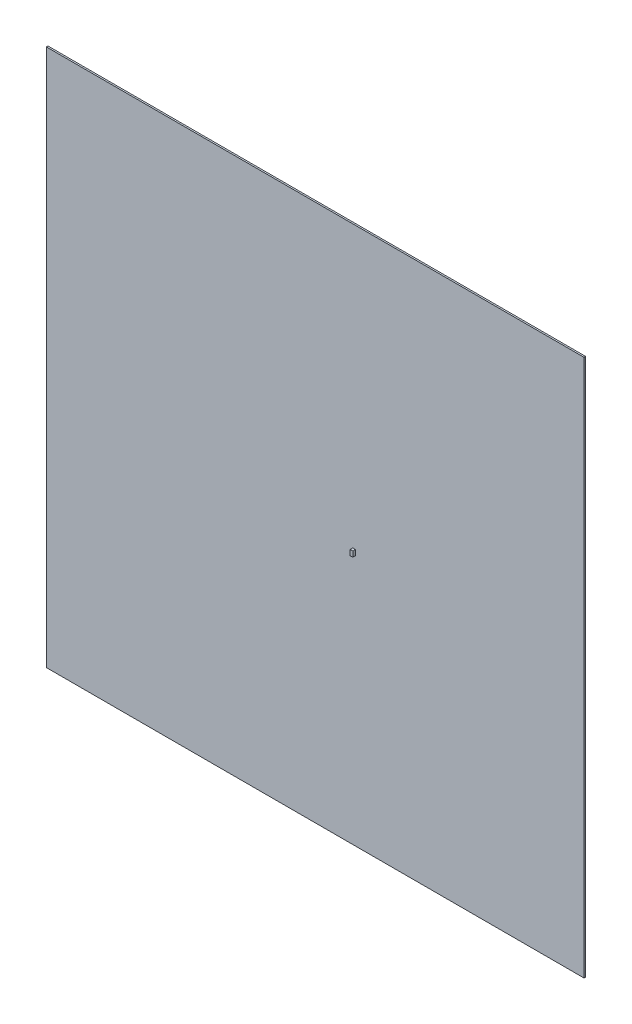
ISO-10303-21;
HEADER;
FILE_DESCRIPTION(('STEP AP214'),'2;1');
FILE_NAME('part.step','',(''),(''),'','','');
FILE_SCHEMA(('AUTOMOTIVE_DESIGN { 1 0 10303 214 1 1 1 1 }'));
ENDSEC;
DATA;
#1=APPLICATION_CONTEXT('core data for automotive mechanical design processes');
#2=APPLICATION_PROTOCOL_DEFINITION('international standard','automotive_design',2000,#1);
#3=PRODUCT_CONTEXT('',#1,'mechanical');
#4=PRODUCT('Part','Part','',(#3));
#5=PRODUCT_RELATED_PRODUCT_CATEGORY('part','',(#4));
#6=PRODUCT_DEFINITION_FORMATION('','',#4);
#7=PRODUCT_DEFINITION_CONTEXT('part definition',#1,'design');
#8=PRODUCT_DEFINITION('design','',#6,#7);
#9=PRODUCT_DEFINITION_SHAPE('','',#8);
#10=(LENGTH_UNIT() NAMED_UNIT(*) SI_UNIT(.MILLI.,.METRE.));
#11=(NAMED_UNIT(*) PLANE_ANGLE_UNIT() SI_UNIT($,.RADIAN.));
#12=(NAMED_UNIT(*) SI_UNIT($,.STERADIAN.) SOLID_ANGLE_UNIT());
#13=UNCERTAINTY_MEASURE_WITH_UNIT(LENGTH_MEASURE(1.E-05),#10,'distance_accuracy_value','');
#14=(GEOMETRIC_REPRESENTATION_CONTEXT(3) GLOBAL_UNCERTAINTY_ASSIGNED_CONTEXT((#13)) GLOBAL_UNIT_ASSIGNED_CONTEXT((#10,
#11,#12)) REPRESENTATION_CONTEXT('',''));
#15=CARTESIAN_POINT('',(0.,0.,0.));
#16=DIRECTION('',(0.,0.,1.));
#17=DIRECTION('',(1.,0.,0.));
#18=AXIS2_PLACEMENT_3D('',#15,#16,#17);
#19=CARTESIAN_POINT('',(0.,0.,30.));
#20=DIRECTION('',(0.,0.,-1.));
#21=DIRECTION('',(-1.,0.,0.));
#22=AXIS2_PLACEMENT_3D('',#19,#20,#21);
#23=PLANE('',#22);
#24=DIRECTION('',(0.,-1.,0.));
#25=VECTOR('',#24,1.);
#26=CARTESIAN_POINT('',(0.,0.,30.));
#27=LINE('',#26,#25);
#28=CARTESIAN_POINT('',(0.,10000.,30.));
#29=VERTEX_POINT('',#28);
#30=CARTESIAN_POINT('',(0.,0.,30.));
#31=VERTEX_POINT('',#30);
#32=EDGE_CURVE('E146',#29,#31,#27,.T.);
#33=ORIENTED_EDGE('',*,*,#32,.T.);
#34=DIRECTION('',(1.,0.,0.));
#35=VECTOR('',#34,1.);
#36=CARTESIAN_POINT('',(0.,0.,30.));
#37=LINE('',#36,#35);
#38=CARTESIAN_POINT('',(10000.,0.,30.));
#39=VERTEX_POINT('',#38);
#40=EDGE_CURVE('E150',#31,#39,#37,.T.);
#41=ORIENTED_EDGE('',*,*,#40,.T.);
#42=DIRECTION('',(0.,1.,0.));
#43=VECTOR('',#42,1.);
#44=CARTESIAN_POINT('',(10000.,0.,30.));
#45=LINE('',#44,#43);
#46=CARTESIAN_POINT('',(10000.,10000.,30.));
#47=VERTEX_POINT('',#46);
#48=EDGE_CURVE('E154',#39,#47,#45,.T.);
#49=ORIENTED_EDGE('',*,*,#48,.T.);
#50=DIRECTION('',(-1.,0.,0.));
#51=VECTOR('',#50,1.);
#52=CARTESIAN_POINT('',(0.,10000.,30.));
#53=LINE('',#52,#51);
#54=EDGE_CURVE('E157',#47,#29,#53,.T.);
#55=ORIENTED_EDGE('',*,*,#54,.T.);
#56=EDGE_LOOP('',(#33,#41,#49,#55));
#57=FACE_BOUND('',#56,.T.);
#58=DIRECTION('',(0.,-1.,0.));
#59=VECTOR('',#58,1.);
#60=CARTESIAN_POINT('',(5699.12748833263,4678.02521922168,30.));
#61=LINE('',#60,#59);
#62=CARTESIAN_POINT('',(5699.12748833263,4778.02521922168,30.));
#63=VERTEX_POINT('',#62);
#64=CARTESIAN_POINT('',(5699.12748833263,4678.02521922168,30.));
#65=VERTEX_POINT('',#64);
#66=EDGE_CURVE('E133',#63,#65,#61,.T.);
#67=ORIENTED_EDGE('',*,*,#66,.F.);
#68=DIRECTION('',(-1.,0.,0.));
#69=VECTOR('',#68,1.);
#70=CARTESIAN_POINT('',(5749.12748833263,4778.02521922168,30.));
#71=LINE('',#70,#69);
#72=CARTESIAN_POINT('',(5749.12748833263,4778.02521922168,30.));
#73=VERTEX_POINT('',#72);
#74=EDGE_CURVE('E130',#73,#63,#71,.T.);
#75=ORIENTED_EDGE('',*,*,#74,.F.);
#76=DIRECTION('',(0.,1.,0.));
#77=VECTOR('',#76,1.);
#78=CARTESIAN_POINT('',(5749.12748833263,4678.02521922168,30.));
#79=LINE('',#78,#77);
#80=CARTESIAN_POINT('',(5749.12748833263,4678.02521922168,30.));
#81=VERTEX_POINT('',#80);
#82=EDGE_CURVE('E66',#81,#73,#79,.T.);
#83=ORIENTED_EDGE('',*,*,#82,.F.);
#84=DIRECTION('',(1.,0.,0.));
#85=VECTOR('',#84,1.);
#86=CARTESIAN_POINT('',(5749.12748833263,4678.02521922168,30.));
#87=LINE('',#86,#85);
#88=EDGE_CURVE('E61',#65,#81,#87,.T.);
#89=ORIENTED_EDGE('',*,*,#88,.F.);
#90=EDGE_LOOP('',(#67,#75,#83,#89));
#91=FACE_BOUND('',#90,.T.);
#92=ADVANCED_FACE('F45',(#57,#91),#23,.F.);
#93=CARTESIAN_POINT('',(0.,0.,30.));
#94=DIRECTION('',(1.,0.,0.));
#95=DIRECTION('',(0.,0.,-1.));
#96=AXIS2_PLACEMENT_3D('',#93,#94,#95);
#97=PLANE('',#96);
#98=DIRECTION('',(0.,-1.,0.));
#99=VECTOR('',#98,1.);
#100=CARTESIAN_POINT('',(0.,0.,0.));
#101=LINE('',#100,#99);
#102=CARTESIAN_POINT('',(0.,10000.,0.));
#103=VERTEX_POINT('',#102);
#104=CARTESIAN_POINT('',(0.,0.,0.));
#105=VERTEX_POINT('',#104);
#106=EDGE_CURVE('E135',#103,#105,#101,.T.);
#107=ORIENTED_EDGE('',*,*,#106,.T.);
#108=DIRECTION('',(0.,0.,-1.));
#109=VECTOR('',#108,1.);
#110=CARTESIAN_POINT('',(0.,0.,30.));
#111=LINE('',#110,#109);
#112=EDGE_CURVE('E11',#31,#105,#111,.T.);
#113=ORIENTED_EDGE('',*,*,#112,.F.);
#114=ORIENTED_EDGE('',*,*,#32,.F.);
#115=DIRECTION('',(0.,0.,-1.));
#116=VECTOR('',#115,1.);
#117=CARTESIAN_POINT('',(0.,10000.,30.));
#118=LINE('',#117,#116);
#119=EDGE_CURVE('E159',#29,#103,#118,.T.);
#120=ORIENTED_EDGE('',*,*,#119,.T.);
#121=EDGE_LOOP('',(#107,#113,#114,#120));
#122=FACE_BOUND('',#121,.T.);
#123=ADVANCED_FACE('F47',(#122),#97,.F.);
#124=CARTESIAN_POINT('',(0.,0.,30.));
#125=DIRECTION('',(0.,1.,0.));
#126=DIRECTION('',(0.,0.,1.));
#127=AXIS2_PLACEMENT_3D('',#124,#125,#126);
#128=PLANE('',#127);
#129=DIRECTION('',(1.,0.,0.));
#130=VECTOR('',#129,1.);
#131=CARTESIAN_POINT('',(0.,0.,0.));
#132=LINE('',#131,#130);
#133=CARTESIAN_POINT('',(10000.,0.,0.));
#134=VERTEX_POINT('',#133);
#135=EDGE_CURVE('E140',#105,#134,#132,.T.);
#136=ORIENTED_EDGE('',*,*,#135,.T.);
#137=DIRECTION('',(0.,0.,-1.));
#138=VECTOR('',#137,1.);
#139=CARTESIAN_POINT('',(10000.,0.,30.));
#140=LINE('',#139,#138);
#141=EDGE_CURVE('E54',#39,#134,#140,.T.);
#142=ORIENTED_EDGE('',*,*,#141,.F.);
#143=ORIENTED_EDGE('',*,*,#40,.F.);
#144=ORIENTED_EDGE('',*,*,#112,.T.);
#145=EDGE_LOOP('',(#136,#142,#143,#144));
#146=FACE_BOUND('',#145,.T.);
#147=ADVANCED_FACE('F195',(#146),#128,.F.);
#148=CARTESIAN_POINT('',(10000.,0.,30.));
#149=DIRECTION('',(-1.,0.,0.));
#150=DIRECTION('',(0.,0.,1.));
#151=AXIS2_PLACEMENT_3D('',#148,#149,#150);
#152=PLANE('',#151);
#153=DIRECTION('',(0.,1.,0.));
#154=VECTOR('',#153,1.);
#155=CARTESIAN_POINT('',(10000.,0.,0.));
#156=LINE('',#155,#154);
#157=CARTESIAN_POINT('',(10000.,10000.,0.));
#158=VERTEX_POINT('',#157);
#159=EDGE_CURVE('E163',#134,#158,#156,.T.);
#160=ORIENTED_EDGE('',*,*,#159,.T.);
#161=DIRECTION('',(0.,0.,-1.));
#162=VECTOR('',#161,1.);
#163=CARTESIAN_POINT('',(10000.,10000.,30.));
#164=LINE('',#163,#162);
#165=EDGE_CURVE('E171',#47,#158,#164,.T.);
#166=ORIENTED_EDGE('',*,*,#165,.F.);
#167=ORIENTED_EDGE('',*,*,#48,.F.);
#168=ORIENTED_EDGE('',*,*,#141,.T.);
#169=EDGE_LOOP('',(#160,#166,#167,#168));
#170=FACE_BOUND('',#169,.T.);
#171=ADVANCED_FACE('F180',(#170),#152,.F.);
#172=CARTESIAN_POINT('',(0.,10000.,30.));
#173=DIRECTION('',(0.,-1.,0.));
#174=DIRECTION('',(0.,0.,-1.));
#175=AXIS2_PLACEMENT_3D('',#172,#173,#174);
#176=PLANE('',#175);
#177=DIRECTION('',(-1.,0.,0.));
#178=VECTOR('',#177,1.);
#179=CARTESIAN_POINT('',(0.,10000.,0.));
#180=LINE('',#179,#178);
#181=EDGE_CURVE('E151',#158,#103,#180,.T.);
#182=ORIENTED_EDGE('',*,*,#181,.T.);
#183=ORIENTED_EDGE('',*,*,#119,.F.);
#184=ORIENTED_EDGE('',*,*,#54,.F.);
#185=ORIENTED_EDGE('',*,*,#165,.T.);
#186=EDGE_LOOP('',(#182,#183,#184,#185));
#187=FACE_BOUND('',#186,.T.);
#188=ADVANCED_FACE('F189',(#187),#176,.F.);
#189=CARTESIAN_POINT('',(0.,0.,0.));
#190=DIRECTION('',(0.,0.,-1.));
#191=DIRECTION('',(-1.,0.,0.));
#192=AXIS2_PLACEMENT_3D('',#189,#190,#191);
#193=PLANE('',#192);
#194=ORIENTED_EDGE('',*,*,#106,.F.);
#195=ORIENTED_EDGE('',*,*,#181,.F.);
#196=ORIENTED_EDGE('',*,*,#159,.F.);
#197=ORIENTED_EDGE('',*,*,#135,.F.);
#198=EDGE_LOOP('',(#194,#195,#196,#197));
#199=FACE_BOUND('',#198,.T.);
#200=ADVANCED_FACE('F186',(#199),#193,.T.);
#201=CARTESIAN_POINT('',(5699.12748833263,4678.02521922168,80.));
#202=DIRECTION('',(1.,0.,0.));
#203=DIRECTION('',(0.,0.,-1.));
#204=AXIS2_PLACEMENT_3D('',#201,#202,#203);
#205=PLANE('',#204);
#206=ORIENTED_EDGE('',*,*,#66,.T.);
#207=DIRECTION('',(0.,0.,-1.));
#208=VECTOR('',#207,1.);
#209=CARTESIAN_POINT('',(5699.12748833263,4678.02521922168,80.));
#210=LINE('',#209,#208);
#211=CARTESIAN_POINT('',(5699.12748833263,4678.02521922168,80.));
#212=VERTEX_POINT('',#211);
#213=EDGE_CURVE('E112',#212,#65,#210,.T.);
#214=ORIENTED_EDGE('',*,*,#213,.F.);
#215=DIRECTION('',(0.,-1.,0.));
#216=VECTOR('',#215,1.);
#217=CARTESIAN_POINT('',(5699.12748833263,4678.02521922168,80.));
#218=LINE('',#217,#216);
#219=CARTESIAN_POINT('',(5699.12748833263,4778.02521922168,80.));
#220=VERTEX_POINT('',#219);
#221=EDGE_CURVE('E120',#220,#212,#218,.T.);
#222=ORIENTED_EDGE('',*,*,#221,.F.);
#223=DIRECTION('',(0.,0.,-1.));
#224=VECTOR('',#223,1.);
#225=CARTESIAN_POINT('',(5699.12748833263,4778.02521922168,80.));
#226=LINE('',#225,#224);
#227=EDGE_CURVE('E310',#220,#63,#226,.T.);
#228=ORIENTED_EDGE('',*,*,#227,.T.);
#229=EDGE_LOOP('',(#206,#214,#222,#228));
#230=FACE_BOUND('',#229,.T.);
#231=ADVANCED_FACE('F132',(#230),#205,.F.);
#232=CARTESIAN_POINT('',(5749.12748833263,4678.02521922168,80.));
#233=DIRECTION('',(0.,1.,0.));
#234=DIRECTION('',(0.,0.,1.));
#235=AXIS2_PLACEMENT_3D('',#232,#233,#234);
#236=PLANE('',#235);
#237=ORIENTED_EDGE('',*,*,#88,.T.);
#238=DIRECTION('',(0.,0.,-1.));
#239=VECTOR('',#238,1.);
#240=CARTESIAN_POINT('',(5749.12748833263,4678.02521922168,80.));
#241=LINE('',#240,#239);
#242=CARTESIAN_POINT('',(5749.12748833263,4678.02521922168,80.));
#243=VERTEX_POINT('',#242);
#244=EDGE_CURVE('E115',#243,#81,#241,.T.);
#245=ORIENTED_EDGE('',*,*,#244,.F.);
#246=DIRECTION('',(1.,0.,0.));
#247=VECTOR('',#246,1.);
#248=CARTESIAN_POINT('',(5749.12748833263,4678.02521922168,80.));
#249=LINE('',#248,#247);
#250=EDGE_CURVE('E108',#212,#243,#249,.T.);
#251=ORIENTED_EDGE('',*,*,#250,.F.);
#252=ORIENTED_EDGE('',*,*,#213,.T.);
#253=EDGE_LOOP('',(#237,#245,#251,#252));
#254=FACE_BOUND('',#253,.T.);
#255=ADVANCED_FACE('F110',(#254),#236,.F.);
#256=CARTESIAN_POINT('',(5749.12748833263,4678.02521922168,80.));
#257=DIRECTION('',(-1.,0.,0.));
#258=DIRECTION('',(0.,0.,1.));
#259=AXIS2_PLACEMENT_3D('',#256,#257,#258);
#260=PLANE('',#259);
#261=ORIENTED_EDGE('',*,*,#82,.T.);
#262=DIRECTION('',(0.,0.,-1.));
#263=VECTOR('',#262,1.);
#264=CARTESIAN_POINT('',(5749.12748833263,4778.02521922168,80.));
#265=LINE('',#264,#263);
#266=CARTESIAN_POINT('',(5749.12748833263,4778.02521922168,80.));
#267=VERTEX_POINT('',#266);
#268=EDGE_CURVE('E142',#267,#73,#265,.T.);
#269=ORIENTED_EDGE('',*,*,#268,.F.);
#270=DIRECTION('',(0.,1.,0.));
#271=VECTOR('',#270,1.);
#272=CARTESIAN_POINT('',(5749.12748833263,4678.02521922168,80.));
#273=LINE('',#272,#271);
#274=EDGE_CURVE('E119',#243,#267,#273,.T.);
#275=ORIENTED_EDGE('',*,*,#274,.F.);
#276=ORIENTED_EDGE('',*,*,#244,.T.);
#277=EDGE_LOOP('',(#261,#269,#275,#276));
#278=FACE_BOUND('',#277,.T.);
#279=ADVANCED_FACE('F236',(#278),#260,.F.);
#280=CARTESIAN_POINT('',(5749.12748833263,4778.02521922168,80.));
#281=DIRECTION('',(0.,-1.,0.));
#282=DIRECTION('',(0.,0.,-1.));
#283=AXIS2_PLACEMENT_3D('',#280,#281,#282);
#284=PLANE('',#283);
#285=ORIENTED_EDGE('',*,*,#74,.T.);
#286=ORIENTED_EDGE('',*,*,#227,.F.);
#287=DIRECTION('',(-1.,0.,0.));
#288=VECTOR('',#287,1.);
#289=CARTESIAN_POINT('',(5749.12748833263,4778.02521922168,80.));
#290=LINE('',#289,#288);
#291=EDGE_CURVE('E125',#267,#220,#290,.T.);
#292=ORIENTED_EDGE('',*,*,#291,.F.);
#293=ORIENTED_EDGE('',*,*,#268,.T.);
#294=EDGE_LOOP('',(#285,#286,#292,#293));
#295=FACE_BOUND('',#294,.T.);
#296=ADVANCED_FACE('F242',(#295),#284,.F.);
#297=CARTESIAN_POINT('',(0.,0.,80.));
#298=DIRECTION('',(0.,0.,1.));
#299=DIRECTION('',(1.,0.,0.));
#300=AXIS2_PLACEMENT_3D('',#297,#298,#299);
#301=PLANE('',#300);
#302=ORIENTED_EDGE('',*,*,#221,.T.);
#303=ORIENTED_EDGE('',*,*,#250,.T.);
#304=ORIENTED_EDGE('',*,*,#274,.T.);
#305=ORIENTED_EDGE('',*,*,#291,.T.);
#306=EDGE_LOOP('',(#302,#303,#304,#305));
#307=FACE_BOUND('',#306,.T.);
#308=ADVANCED_FACE('F123',(#307),#301,.T.);
#309=CLOSED_SHELL('',(#92,#123,#147,#171,#188,#200,#231,#255,#279,#296,#308));
#310=MANIFOLD_SOLID_BREP('B2',#309);
#311=ADVANCED_BREP_SHAPE_REPRESENTATION('',(#18,#310),#14);
#312=SHAPE_DEFINITION_REPRESENTATION(#9,#311);
ENDSEC;
END-ISO-10303-21;
